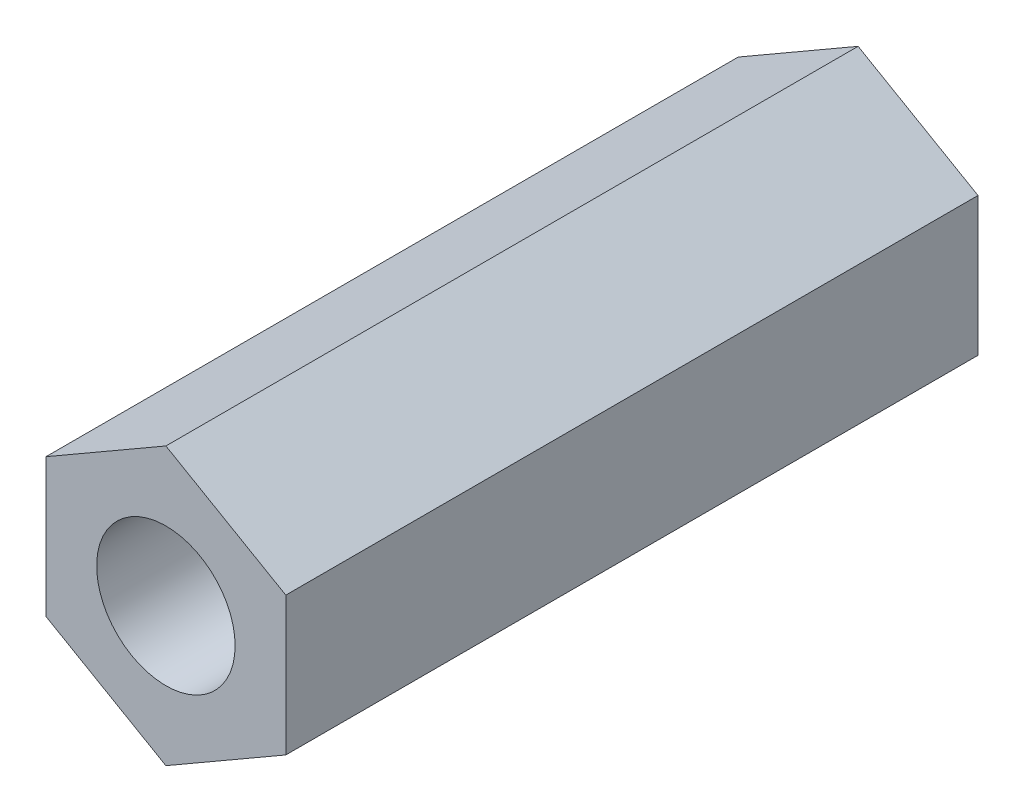
ISO-10303-21;
HEADER;
FILE_DESCRIPTION(('STEP AP214'),'2;1');
FILE_NAME('part.step','',(''),(''),'','','');
FILE_SCHEMA(('AUTOMOTIVE_DESIGN { 1 0 10303 214 1 1 1 1 }'));
ENDSEC;
DATA;
#1=APPLICATION_CONTEXT('core data for automotive mechanical design processes');
#2=APPLICATION_PROTOCOL_DEFINITION('international standard','automotive_design',2000,#1);
#3=PRODUCT_CONTEXT('',#1,'mechanical');
#4=PRODUCT('Part','Part','',(#3));
#5=PRODUCT_RELATED_PRODUCT_CATEGORY('part','',(#4));
#6=PRODUCT_DEFINITION_FORMATION('','',#4);
#7=PRODUCT_DEFINITION_CONTEXT('part definition',#1,'design');
#8=PRODUCT_DEFINITION('design','',#6,#7);
#9=PRODUCT_DEFINITION_SHAPE('','',#8);
#10=(LENGTH_UNIT() NAMED_UNIT(*) SI_UNIT(.MILLI.,.METRE.));
#11=(NAMED_UNIT(*) PLANE_ANGLE_UNIT() SI_UNIT($,.RADIAN.));
#12=(NAMED_UNIT(*) SI_UNIT($,.STERADIAN.) SOLID_ANGLE_UNIT());
#13=UNCERTAINTY_MEASURE_WITH_UNIT(LENGTH_MEASURE(1.E-05),#10,'distance_accuracy_value','');
#14=(GEOMETRIC_REPRESENTATION_CONTEXT(3) GLOBAL_UNCERTAINTY_ASSIGNED_CONTEXT((#13)) GLOBAL_UNIT_ASSIGNED_CONTEXT((#10,
#11,#12)) REPRESENTATION_CONTEXT('',''));
#15=CARTESIAN_POINT('',(0.,0.,0.));
#16=DIRECTION('',(0.,0.,1.));
#17=DIRECTION('',(1.,0.,0.));
#18=AXIS2_PLACEMENT_3D('',#15,#16,#17);
#19=CARTESIAN_POINT('',(0.,0.,2.5));
#20=DIRECTION('',(0.,0.,1.));
#21=DIRECTION('',(1.,0.,0.));
#22=AXIS2_PLACEMENT_3D('',#19,#20,#21);
#23=PLANE('',#22);
#24=DIRECTION('',(-0.866025403784442,0.499999999999995,0.));
#25=VECTOR('',#24,1.);
#26=CARTESIAN_POINT('',(0.433012701892216,0.250000000000005,2.5));
#27=LINE('',#26,#25);
#28=CARTESIAN_POINT('',(0.433012701892216,0.250000000000005,2.5));
#29=VERTEX_POINT('',#28);
#30=CARTESIAN_POINT('',(0.,0.5,2.5));
#31=VERTEX_POINT('',#30);
#32=EDGE_CURVE('E131',#29,#31,#27,.T.);
#33=ORIENTED_EDGE('',*,*,#32,.T.);
#34=DIRECTION('',(-0.866025403784438,-0.500000000000001,0.));
#35=VECTOR('',#34,1.);
#36=CARTESIAN_POINT('',(0.,0.5,2.5));
#37=LINE('',#36,#35);
#38=CARTESIAN_POINT('',(-0.43301270189222,0.249999999999999,2.5));
#39=VERTEX_POINT('',#38);
#40=EDGE_CURVE('E89',#31,#39,#37,.T.);
#41=ORIENTED_EDGE('',*,*,#40,.T.);
#42=DIRECTION('',(0.,-1.,0.));
#43=VECTOR('',#42,1.);
#44=CARTESIAN_POINT('',(-0.43301270189222,0.249999999999999,2.5));
#45=LINE('',#44,#43);
#46=CARTESIAN_POINT('',(-0.433012701892218,-0.250000000000002,2.5));
#47=VERTEX_POINT('',#46);
#48=EDGE_CURVE('E102',#39,#47,#45,.T.);
#49=ORIENTED_EDGE('',*,*,#48,.T.);
#50=DIRECTION('',(0.866025403784442,-0.499999999999995,0.));
#51=VECTOR('',#50,1.);
#52=CARTESIAN_POINT('',(-0.433012701892218,-0.250000000000002,2.5));
#53=LINE('',#52,#51);
#54=CARTESIAN_POINT('',(0.,-0.5,2.5));
#55=VERTEX_POINT('',#54);
#56=EDGE_CURVE('E96',#47,#55,#53,.T.);
#57=ORIENTED_EDGE('',*,*,#56,.T.);
#58=DIRECTION('',(0.866025403784435,0.500000000000007,0.));
#59=VECTOR('',#58,1.);
#60=CARTESIAN_POINT('',(0.,-0.5,2.5));
#61=LINE('',#60,#59);
#62=CARTESIAN_POINT('',(0.433012701892222,-0.249999999999996,2.5));
#63=VERTEX_POINT('',#62);
#64=EDGE_CURVE('E100',#55,#63,#61,.T.);
#65=ORIENTED_EDGE('',*,*,#64,.T.);
#66=DIRECTION('',(0.,1.,0.));
#67=VECTOR('',#66,1.);
#68=CARTESIAN_POINT('',(0.433012701892222,-0.249999999999996,2.5));
#69=LINE('',#68,#67);
#70=EDGE_CURVE('E52',#63,#29,#69,.T.);
#71=ORIENTED_EDGE('',*,*,#70,.T.);
#72=EDGE_LOOP('',(#33,#41,#49,#57,#65,#71));
#73=FACE_BOUND('',#72,.T.);
#74=CARTESIAN_POINT('',(0.,0.,2.5));
#75=DIRECTION('',(0.,0.,1.));
#76=DIRECTION('',(1.,0.,0.));
#77=AXIS2_PLACEMENT_3D('',#74,#75,#76);
#78=CIRCLE('',#77,0.25);
#79=CARTESIAN_POINT('',(0.25,0.,2.5));
#80=VERTEX_POINT('',#79);
#81=EDGE_CURVE('E124',#80,#80,#78,.T.);
#82=ORIENTED_EDGE('',*,*,#81,.F.);
#83=EDGE_LOOP('',(#82));
#84=FACE_BOUND('',#83,.T.);
#85=ADVANCED_FACE('F35',(#73,#84),#23,.T.);
#86=CARTESIAN_POINT('',(0.,0.,0.));
#87=DIRECTION('',(0.,0.,1.));
#88=DIRECTION('',(1.,0.,0.));
#89=AXIS2_PLACEMENT_3D('',#86,#87,#88);
#90=PLANE('',#89);
#91=DIRECTION('',(-0.866025403784442,0.499999999999995,0.));
#92=VECTOR('',#91,1.);
#93=CARTESIAN_POINT('',(0.433012701892216,0.250000000000005,0.));
#94=LINE('',#93,#92);
#95=CARTESIAN_POINT('',(0.433012701892216,0.250000000000005,0.));
#96=VERTEX_POINT('',#95);
#97=CARTESIAN_POINT('',(0.,0.5,0.));
#98=VERTEX_POINT('',#97);
#99=EDGE_CURVE('E120',#96,#98,#94,.T.);
#100=ORIENTED_EDGE('',*,*,#99,.F.);
#101=DIRECTION('',(0.,1.,0.));
#102=VECTOR('',#101,1.);
#103=CARTESIAN_POINT('',(0.433012701892222,-0.249999999999996,0.));
#104=LINE('',#103,#102);
#105=CARTESIAN_POINT('',(0.433012701892222,-0.249999999999996,0.));
#106=VERTEX_POINT('',#105);
#107=EDGE_CURVE('E81',#106,#96,#104,.T.);
#108=ORIENTED_EDGE('',*,*,#107,.F.);
#109=DIRECTION('',(0.866025403784435,0.500000000000007,0.));
#110=VECTOR('',#109,1.);
#111=CARTESIAN_POINT('',(0.,-0.5,0.));
#112=LINE('',#111,#110);
#113=CARTESIAN_POINT('',(0.,-0.5,0.));
#114=VERTEX_POINT('',#113);
#115=EDGE_CURVE('E75',#114,#106,#112,.T.);
#116=ORIENTED_EDGE('',*,*,#115,.F.);
#117=DIRECTION('',(0.866025403784442,-0.499999999999995,0.));
#118=VECTOR('',#117,1.);
#119=CARTESIAN_POINT('',(-0.433012701892218,-0.250000000000002,0.));
#120=LINE('',#119,#118);
#121=CARTESIAN_POINT('',(-0.433012701892218,-0.250000000000002,0.));
#122=VERTEX_POINT('',#121);
#123=EDGE_CURVE('E110',#122,#114,#120,.T.);
#124=ORIENTED_EDGE('',*,*,#123,.F.);
#125=DIRECTION('',(0.,-1.,0.));
#126=VECTOR('',#125,1.);
#127=CARTESIAN_POINT('',(-0.43301270189222,0.249999999999999,0.));
#128=LINE('',#127,#126);
#129=CARTESIAN_POINT('',(-0.43301270189222,0.249999999999999,0.));
#130=VERTEX_POINT('',#129);
#131=EDGE_CURVE('E126',#130,#122,#128,.T.);
#132=ORIENTED_EDGE('',*,*,#131,.F.);
#133=DIRECTION('',(-0.866025403784438,-0.500000000000001,0.));
#134=VECTOR('',#133,1.);
#135=CARTESIAN_POINT('',(0.,0.5,0.));
#136=LINE('',#135,#134);
#137=EDGE_CURVE('E123',#98,#130,#136,.T.);
#138=ORIENTED_EDGE('',*,*,#137,.F.);
#139=EDGE_LOOP('',(#100,#108,#116,#124,#132,#138));
#140=FACE_BOUND('',#139,.T.);
#141=CARTESIAN_POINT('',(0.,0.,0.));
#142=DIRECTION('',(0.,0.,1.));
#143=DIRECTION('',(1.,0.,0.));
#144=AXIS2_PLACEMENT_3D('',#141,#142,#143);
#145=CIRCLE('',#144,0.25);
#146=CARTESIAN_POINT('',(0.25,0.,0.));
#147=VERTEX_POINT('',#146);
#148=EDGE_CURVE('E224',#147,#147,#145,.T.);
#149=ORIENTED_EDGE('',*,*,#148,.T.);
#150=EDGE_LOOP('',(#149));
#151=FACE_BOUND('',#150,.T.);
#152=ADVANCED_FACE('F140',(#140,#151),#90,.F.);
#153=CARTESIAN_POINT('',(0.433012701892216,0.250000000000005,2.5));
#154=DIRECTION('',(-0.499999999999995,-0.866025403784442,0.));
#155=DIRECTION('',(0.866025403784442,-0.499999999999995,0.));
#156=AXIS2_PLACEMENT_3D('',#153,#154,#155);
#157=PLANE('',#156);
#158=ORIENTED_EDGE('',*,*,#99,.T.);
#159=DIRECTION('',(0.,0.,-1.));
#160=VECTOR('',#159,1.);
#161=CARTESIAN_POINT('',(0.,0.5,2.5));
#162=LINE('',#161,#160);
#163=EDGE_CURVE('E11',#31,#98,#162,.T.);
#164=ORIENTED_EDGE('',*,*,#163,.F.);
#165=ORIENTED_EDGE('',*,*,#32,.F.);
#166=DIRECTION('',(0.,0.,-1.));
#167=VECTOR('',#166,1.);
#168=CARTESIAN_POINT('',(0.433012701892216,0.250000000000005,2.5));
#169=LINE('',#168,#167);
#170=EDGE_CURVE('E116',#29,#96,#169,.T.);
#171=ORIENTED_EDGE('',*,*,#170,.T.);
#172=EDGE_LOOP('',(#158,#164,#165,#171));
#173=FACE_BOUND('',#172,.T.);
#174=ADVANCED_FACE('F37',(#173),#157,.F.);
#175=CARTESIAN_POINT('',(0.,0.5,2.5));
#176=DIRECTION('',(0.500000000000001,-0.866025403784438,0.));
#177=DIRECTION('',(0.866025403784438,0.500000000000001,0.));
#178=AXIS2_PLACEMENT_3D('',#175,#176,#177);
#179=PLANE('',#178);
#180=ORIENTED_EDGE('',*,*,#137,.T.);
#181=DIRECTION('',(0.,0.,-1.));
#182=VECTOR('',#181,1.);
#183=CARTESIAN_POINT('',(-0.43301270189222,0.249999999999999,2.5));
#184=LINE('',#183,#182);
#185=EDGE_CURVE('E44',#39,#130,#184,.T.);
#186=ORIENTED_EDGE('',*,*,#185,.F.);
#187=ORIENTED_EDGE('',*,*,#40,.F.);
#188=ORIENTED_EDGE('',*,*,#163,.T.);
#189=EDGE_LOOP('',(#180,#186,#187,#188));
#190=FACE_BOUND('',#189,.T.);
#191=ADVANCED_FACE('F165',(#190),#179,.F.);
#192=CARTESIAN_POINT('',(-0.43301270189222,0.249999999999999,2.5));
#193=DIRECTION('',(1.,0.,0.));
#194=DIRECTION('',(0.,1.,0.));
#195=AXIS2_PLACEMENT_3D('',#192,#193,#194);
#196=PLANE('',#195);
#197=ORIENTED_EDGE('',*,*,#131,.T.);
#198=DIRECTION('',(0.,0.,-1.));
#199=VECTOR('',#198,1.);
#200=CARTESIAN_POINT('',(-0.433012701892218,-0.250000000000002,2.5));
#201=LINE('',#200,#199);
#202=EDGE_CURVE('E111',#47,#122,#201,.T.);
#203=ORIENTED_EDGE('',*,*,#202,.F.);
#204=ORIENTED_EDGE('',*,*,#48,.F.);
#205=ORIENTED_EDGE('',*,*,#185,.T.);
#206=EDGE_LOOP('',(#197,#203,#204,#205));
#207=FACE_BOUND('',#206,.T.);
#208=ADVANCED_FACE('F137',(#207),#196,.F.);
#209=CARTESIAN_POINT('',(-0.433012701892218,-0.250000000000002,2.5));
#210=DIRECTION('',(0.499999999999995,0.866025403784442,0.));
#211=DIRECTION('',(-0.866025403784442,0.499999999999995,0.));
#212=AXIS2_PLACEMENT_3D('',#209,#210,#211);
#213=PLANE('',#212);
#214=ORIENTED_EDGE('',*,*,#123,.T.);
#215=DIRECTION('',(0.,0.,-1.));
#216=VECTOR('',#215,1.);
#217=CARTESIAN_POINT('',(0.,-0.5,2.5));
#218=LINE('',#217,#216);
#219=EDGE_CURVE('E107',#55,#114,#218,.T.);
#220=ORIENTED_EDGE('',*,*,#219,.F.);
#221=ORIENTED_EDGE('',*,*,#56,.F.);
#222=ORIENTED_EDGE('',*,*,#202,.T.);
#223=EDGE_LOOP('',(#214,#220,#221,#222));
#224=FACE_BOUND('',#223,.T.);
#225=ADVANCED_FACE('F108',(#224),#213,.F.);
#226=CARTESIAN_POINT('',(0.,-0.5,2.5));
#227=DIRECTION('',(-0.500000000000007,0.866025403784434,0.));
#228=DIRECTION('',(-0.866025403784435,-0.500000000000007,0.));
#229=AXIS2_PLACEMENT_3D('',#226,#227,#228);
#230=PLANE('',#229);
#231=ORIENTED_EDGE('',*,*,#115,.T.);
#232=DIRECTION('',(0.,0.,-1.));
#233=VECTOR('',#232,1.);
#234=CARTESIAN_POINT('',(0.433012701892222,-0.249999999999996,2.5));
#235=LINE('',#234,#233);
#236=EDGE_CURVE('E112',#63,#106,#235,.T.);
#237=ORIENTED_EDGE('',*,*,#236,.F.);
#238=ORIENTED_EDGE('',*,*,#64,.F.);
#239=ORIENTED_EDGE('',*,*,#219,.T.);
#240=EDGE_LOOP('',(#231,#237,#238,#239));
#241=FACE_BOUND('',#240,.T.);
#242=ADVANCED_FACE('F114',(#241),#230,.F.);
#243=CARTESIAN_POINT('',(0.433012701892222,-0.249999999999996,2.5));
#244=DIRECTION('',(-1.,0.,0.));
#245=DIRECTION('',(0.,-1.,0.));
#246=AXIS2_PLACEMENT_3D('',#243,#244,#245);
#247=PLANE('',#246);
#248=ORIENTED_EDGE('',*,*,#107,.T.);
#249=ORIENTED_EDGE('',*,*,#170,.F.);
#250=ORIENTED_EDGE('',*,*,#70,.F.);
#251=ORIENTED_EDGE('',*,*,#236,.T.);
#252=EDGE_LOOP('',(#248,#249,#250,#251));
#253=FACE_BOUND('',#252,.T.);
#254=ADVANCED_FACE('F145',(#253),#247,.F.);
#255=CARTESIAN_POINT('',(0.,0.,2.5));
#256=DIRECTION('',(0.,0.,-1.));
#257=DIRECTION('',(-1.,0.,0.));
#258=AXIS2_PLACEMENT_3D('',#255,#256,#257);
#259=CYLINDRICAL_SURFACE('',#258,0.25);
#260=ORIENTED_EDGE('',*,*,#81,.T.);
#261=EDGE_LOOP('',(#260));
#262=FACE_BOUND('',#261,.T.);
#263=ORIENTED_EDGE('',*,*,#148,.F.);
#264=EDGE_LOOP('',(#263));
#265=FACE_BOUND('',#264,.T.);
#266=ADVANCED_FACE('F147',(#262,#265),#259,.F.);
#267=CLOSED_SHELL('',(#85,#152,#174,#191,#208,#225,#242,#254,#266));
#268=MANIFOLD_SOLID_BREP('B2',#267);
#269=ADVANCED_BREP_SHAPE_REPRESENTATION('',(#18,#268),#14);
#270=SHAPE_DEFINITION_REPRESENTATION(#9,#269);
ENDSEC;
END-ISO-10303-21;
